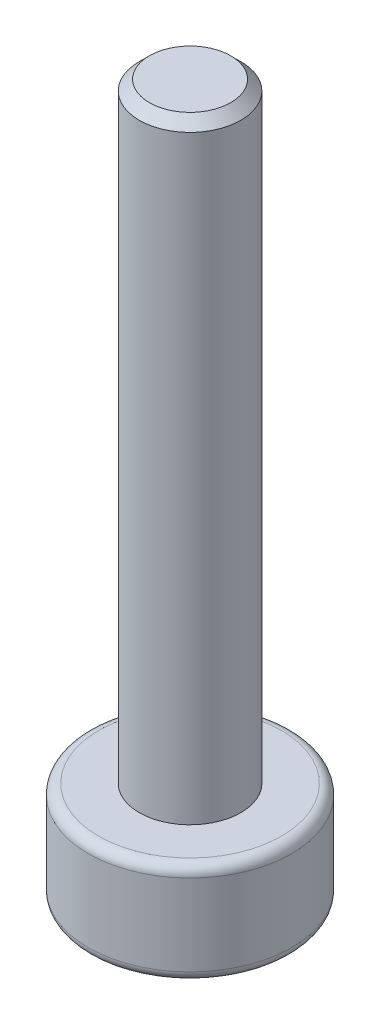
ISO-10303-21;
HEADER;
FILE_DESCRIPTION(('STEP AP214'),'2;1');
FILE_NAME('part.step','',(''),(''),'','','');
FILE_SCHEMA(('AUTOMOTIVE_DESIGN { 1 0 10303 214 1 1 1 1 }'));
ENDSEC;
DATA;
#1=APPLICATION_CONTEXT('core data for automotive mechanical design processes');
#2=APPLICATION_PROTOCOL_DEFINITION('international standard','automotive_design',2000,#1);
#3=PRODUCT_CONTEXT('',#1,'mechanical');
#4=PRODUCT('Part','Part','',(#3));
#5=PRODUCT_RELATED_PRODUCT_CATEGORY('part','',(#4));
#6=PRODUCT_DEFINITION_FORMATION('','',#4);
#7=PRODUCT_DEFINITION_CONTEXT('part definition',#1,'design');
#8=PRODUCT_DEFINITION('design','',#6,#7);
#9=PRODUCT_DEFINITION_SHAPE('','',#8);
#10=(LENGTH_UNIT() NAMED_UNIT(*) SI_UNIT(.MILLI.,.METRE.));
#11=(NAMED_UNIT(*) PLANE_ANGLE_UNIT() SI_UNIT($,.RADIAN.));
#12=(NAMED_UNIT(*) SI_UNIT($,.STERADIAN.) SOLID_ANGLE_UNIT());
#13=UNCERTAINTY_MEASURE_WITH_UNIT(LENGTH_MEASURE(1.E-05),#10,'distance_accuracy_value','');
#14=(GEOMETRIC_REPRESENTATION_CONTEXT(3) GLOBAL_UNCERTAINTY_ASSIGNED_CONTEXT((#13)) GLOBAL_UNIT_ASSIGNED_CONTEXT((#10,
#11,#12)) REPRESENTATION_CONTEXT('',''));
#15=CARTESIAN_POINT('',(0.,0.,0.));
#16=DIRECTION('',(0.,0.,1.));
#17=DIRECTION('',(1.,0.,0.));
#18=AXIS2_PLACEMENT_3D('',#15,#16,#17);
#19=CARTESIAN_POINT('',(0.,2.,0.));
#20=DIRECTION('',(0.,-1.,0.));
#21=DIRECTION('',(0.,0.,-1.));
#22=AXIS2_PLACEMENT_3D('',#19,#20,#21);
#23=CYLINDRICAL_SURFACE('',#22,2.);
#24=CARTESIAN_POINT('',(0.,0.2,0.));
#25=DIRECTION('',(0.,1.,0.));
#26=DIRECTION('',(0.,0.,1.));
#27=AXIS2_PLACEMENT_3D('',#24,#25,#26);
#28=CIRCLE('',#27,2.);
#29=CARTESIAN_POINT('',(0.,0.2,2.));
#30=VERTEX_POINT('',#29);
#31=EDGE_CURVE('E72',#30,#30,#28,.T.);
#32=ORIENTED_EDGE('',*,*,#31,.T.);
#33=EDGE_LOOP('',(#32));
#34=FACE_BOUND('',#33,.T.);
#35=CARTESIAN_POINT('',(0.,1.8,0.));
#36=DIRECTION('',(0.,1.,0.));
#37=DIRECTION('',(0.,0.,1.));
#38=AXIS2_PLACEMENT_3D('',#35,#36,#37);
#39=CIRCLE('',#38,2.);
#40=CARTESIAN_POINT('',(0.,1.8,2.));
#41=VERTEX_POINT('',#40);
#42=EDGE_CURVE('E76',#41,#41,#39,.F.);
#43=ORIENTED_EDGE('',*,*,#42,.T.);
#44=EDGE_LOOP('',(#43));
#45=FACE_BOUND('',#44,.T.);
#46=ADVANCED_FACE('F39',(#34,#45),#23,.T.);
#47=CARTESIAN_POINT('',(0.,2.,0.));
#48=DIRECTION('',(0.,1.,0.));
#49=DIRECTION('',(0.,0.,1.));
#50=AXIS2_PLACEMENT_3D('',#47,#48,#49);
#51=PLANE('',#50);
#52=CARTESIAN_POINT('',(0.,2.,0.));
#53=DIRECTION('',(0.,1.,0.));
#54=DIRECTION('',(0.,0.,1.));
#55=AXIS2_PLACEMENT_3D('',#52,#53,#54);
#56=CIRCLE('',#55,1.8);
#57=CARTESIAN_POINT('',(0.,2.,1.8));
#58=VERTEX_POINT('',#57);
#59=EDGE_CURVE('E64',#58,#58,#56,.T.);
#60=ORIENTED_EDGE('',*,*,#59,.T.);
#61=EDGE_LOOP('',(#60));
#62=FACE_BOUND('',#61,.T.);
#63=CARTESIAN_POINT('',(0.,2.,0.));
#64=DIRECTION('',(0.,1.,0.));
#65=DIRECTION('',(0.,0.,1.));
#66=AXIS2_PLACEMENT_3D('',#63,#64,#65);
#67=CIRCLE('',#66,1.);
#68=CARTESIAN_POINT('',(0.,2.,1.));
#69=VERTEX_POINT('',#68);
#70=EDGE_CURVE('E80',#69,#69,#67,.T.);
#71=ORIENTED_EDGE('',*,*,#70,.F.);
#72=EDGE_LOOP('',(#71));
#73=FACE_BOUND('',#72,.T.);
#74=ADVANCED_FACE('F107',(#62,#73),#51,.T.);
#75=CARTESIAN_POINT('',(0.,0.,0.));
#76=DIRECTION('',(0.,1.,0.));
#77=DIRECTION('',(0.,0.,1.));
#78=AXIS2_PLACEMENT_3D('',#75,#76,#77);
#79=PLANE('',#78);
#80=CARTESIAN_POINT('',(0.,0.,0.));
#81=DIRECTION('',(0.,1.,0.));
#82=DIRECTION('',(0.,0.,1.));
#83=AXIS2_PLACEMENT_3D('',#80,#81,#82);
#84=CIRCLE('',#83,0.864999999999996);
#85=CARTESIAN_POINT('',(0.,0.,-0.864999999999996));
#86=VERTEX_POINT('',#85);
#87=EDGE_CURVE('E53',#86,#86,#84,.T.);
#88=ORIENTED_EDGE('',*,*,#87,.T.);
#89=EDGE_LOOP('',(#88));
#90=FACE_BOUND('',#89,.T.);
#91=CARTESIAN_POINT('',(0.,0.,0.));
#92=DIRECTION('',(0.,1.,0.));
#93=DIRECTION('',(0.,0.,1.));
#94=AXIS2_PLACEMENT_3D('',#91,#92,#93);
#95=CIRCLE('',#94,1.8);
#96=CARTESIAN_POINT('',(0.,0.,1.8));
#97=VERTEX_POINT('',#96);
#98=EDGE_CURVE('E68',#97,#97,#95,.F.);
#99=ORIENTED_EDGE('',*,*,#98,.T.);
#100=EDGE_LOOP('',(#99));
#101=FACE_BOUND('',#100,.T.);
#102=ADVANCED_FACE('F113',(#90,#101),#79,.F.);
#103=CARTESIAN_POINT('',(0.,14.,0.));
#104=DIRECTION('',(0.,-1.,0.));
#105=DIRECTION('',(0.,0.,-1.));
#106=AXIS2_PLACEMENT_3D('',#103,#104,#105);
#107=CYLINDRICAL_SURFACE('',#106,1.);
#108=CARTESIAN_POINT('',(0.,13.8,0.));
#109=DIRECTION('',(0.,1.,0.));
#110=DIRECTION('',(0.,0.,1.));
#111=AXIS2_PLACEMENT_3D('',#108,#109,#110);
#112=CIRCLE('',#111,1.);
#113=CARTESIAN_POINT('',(0.,13.8,1.));
#114=VERTEX_POINT('',#113);
#115=EDGE_CURVE('E10',#114,#114,#112,.F.);
#116=ORIENTED_EDGE('',*,*,#115,.T.);
#117=EDGE_LOOP('',(#116));
#118=FACE_BOUND('',#117,.T.);
#119=ORIENTED_EDGE('',*,*,#70,.T.);
#120=EDGE_LOOP('',(#119));
#121=FACE_BOUND('',#120,.T.);
#122=ADVANCED_FACE('F137',(#118,#121),#107,.T.);
#123=CARTESIAN_POINT('',(0.,14.,0.));
#124=DIRECTION('',(0.,1.,0.));
#125=DIRECTION('',(0.,0.,1.));
#126=AXIS2_PLACEMENT_3D('',#123,#124,#125);
#127=PLANE('',#126);
#128=CARTESIAN_POINT('',(0.,14.,0.));
#129=DIRECTION('',(0.,1.,0.));
#130=DIRECTION('',(0.,0.,1.));
#131=AXIS2_PLACEMENT_3D('',#128,#129,#130);
#132=CIRCLE('',#131,0.799999999999999);
#133=CARTESIAN_POINT('',(0.,14.,0.799999999999999));
#134=VERTEX_POINT('',#133);
#135=EDGE_CURVE('E48',#134,#134,#132,.T.);
#136=ORIENTED_EDGE('',*,*,#135,.T.);
#137=EDGE_LOOP('',(#136));
#138=FACE_BOUND('',#137,.T.);
#139=ADVANCED_FACE('F120',(#138),#127,.T.);
#140=CARTESIAN_POINT('',(0.,0.2,0.));
#141=DIRECTION('',(0.,1.,0.));
#142=DIRECTION('',(0.,0.,1.));
#143=AXIS2_PLACEMENT_3D('',#140,#141,#142);
#144=TOROIDAL_SURFACE('',#143,1.8,0.2);
#145=ORIENTED_EDGE('',*,*,#98,.F.);
#146=EDGE_LOOP('',(#145));
#147=FACE_BOUND('',#146,.T.);
#148=ORIENTED_EDGE('',*,*,#31,.F.);
#149=EDGE_LOOP('',(#148));
#150=FACE_BOUND('',#149,.T.);
#151=ADVANCED_FACE('F102',(#147,#150),#144,.T.);
#152=CARTESIAN_POINT('',(0.,1.8,0.));
#153=DIRECTION('',(0.,1.,0.));
#154=DIRECTION('',(0.,0.,1.));
#155=AXIS2_PLACEMENT_3D('',#152,#153,#154);
#156=TOROIDAL_SURFACE('',#155,1.8,0.2);
#157=ORIENTED_EDGE('',*,*,#42,.F.);
#158=EDGE_LOOP('',(#157));
#159=FACE_BOUND('',#158,.T.);
#160=ORIENTED_EDGE('',*,*,#59,.F.);
#161=EDGE_LOOP('',(#160));
#162=FACE_BOUND('',#161,.T.);
#163=ADVANCED_FACE('F93',(#159,#162),#156,.T.);
#164=CARTESIAN_POINT('',(0.,1.52,0.));
#165=DIRECTION('',(0.,-1.,0.));
#166=DIRECTION('',(0.,0.,-1.));
#167=AXIS2_PLACEMENT_3D('',#164,#165,#166);
#168=CYLINDRICAL_SURFACE('',#167,0.765);
#169=CARTESIAN_POINT('',(0.,0.0999999999999968,0.));
#170=DIRECTION('',(0.,1.,0.));
#171=DIRECTION('',(0.,0.,1.));
#172=AXIS2_PLACEMENT_3D('',#169,#170,#171);
#173=CIRCLE('',#172,0.765);
#174=CARTESIAN_POINT('',(0.,0.0999999999999968,-0.765));
#175=VERTEX_POINT('',#174);
#176=EDGE_CURVE('E58',#175,#175,#173,.F.);
#177=ORIENTED_EDGE('',*,*,#176,.T.);
#178=EDGE_LOOP('',(#177));
#179=FACE_BOUND('',#178,.T.);
#180=CARTESIAN_POINT('',(0.,1.52,0.));
#181=DIRECTION('',(0.,-1.,0.));
#182=DIRECTION('',(0.,0.,-1.));
#183=AXIS2_PLACEMENT_3D('',#180,#181,#182);
#184=CIRCLE('',#183,0.765);
#185=CARTESIAN_POINT('',(0.,1.52,-0.765));
#186=VERTEX_POINT('',#185);
#187=EDGE_CURVE('E84',#186,#186,#184,.T.);
#188=ORIENTED_EDGE('',*,*,#187,.F.);
#189=EDGE_LOOP('',(#188));
#190=FACE_BOUND('',#189,.T.);
#191=ADVANCED_FACE('F91',(#179,#190),#168,.F.);
#192=CARTESIAN_POINT('',(0.,1.52,0.));
#193=DIRECTION('',(0.,-1.,0.));
#194=DIRECTION('',(0.,0.,-1.));
#195=AXIS2_PLACEMENT_3D('',#192,#193,#194);
#196=PLANE('',#195);
#197=ORIENTED_EDGE('',*,*,#187,.T.);
#198=EDGE_LOOP('',(#197));
#199=FACE_BOUND('',#198,.T.);
#200=ADVANCED_FACE('F89',(#199),#196,.T.);
#201=CARTESIAN_POINT('',(0.,0.0999999999999968,0.));
#202=DIRECTION('',(0.,-1.,0.));
#203=DIRECTION('',(0.,0.,-1.));
#204=AXIS2_PLACEMENT_3D('',#201,#202,#203);
#205=CONICAL_SURFACE('',#204,0.765,0.785398163397443);
#206=CARTESIAN_POINT('',(0.,0.,-0.864999999999996));
#207=CARTESIAN_POINT('',(0.,0.00104166666666662,-0.863958333333329));
#208=CARTESIAN_POINT('',(0.,0.00208333333333325,-0.862916666666663));
#209=CARTESIAN_POINT('',(0.,0.00416666666666652,-0.860833333333329));
#210=CARTESIAN_POINT('',(0.,0.00520833333333315,-0.859791666666663));
#211=CARTESIAN_POINT('',(0.,0.00729166666666642,-0.85770833333333));
#212=CARTESIAN_POINT('',(0.,0.00833333333333305,-0.856666666666663));
#213=CARTESIAN_POINT('',(0.,0.0104166666666663,-0.85458333333333));
#214=CARTESIAN_POINT('',(0.,0.011458333333333,-0.853541666666663));
#215=CARTESIAN_POINT('',(0.,0.0135416666666662,-0.85145833333333));
#216=CARTESIAN_POINT('',(0.,0.0145833333333329,-0.850416666666663));
#217=CARTESIAN_POINT('',(0.,0.0166666666666661,-0.84833333333333));
#218=CARTESIAN_POINT('',(0.,0.0177083333333327,-0.847291666666663));
#219=CARTESIAN_POINT('',(0.,0.019791666666666,-0.84520833333333));
#220=CARTESIAN_POINT('',(0.,0.0208333333333327,-0.844166666666663));
#221=CARTESIAN_POINT('',(0.,0.0229166666666659,-0.84208333333333));
#222=CARTESIAN_POINT('',(0.,0.0239583333333326,-0.841041666666664));
#223=CARTESIAN_POINT('',(0.,0.0260416666666658,-0.83895833333333));
#224=CARTESIAN_POINT('',(0.,0.0270833333333324,-0.837916666666664));
#225=CARTESIAN_POINT('',(0.,0.0291666666666657,-0.83583333333333));
#226=CARTESIAN_POINT('',(0.,0.0302083333333324,-0.834791666666664));
#227=CARTESIAN_POINT('',(0.,0.0322916666666656,-0.832708333333331));
#228=CARTESIAN_POINT('',(0.,0.0333333333333323,-0.831666666666664));
#229=CARTESIAN_POINT('',(0.,0.0354166666666655,-0.829583333333331));
#230=CARTESIAN_POINT('',(0.,0.0364583333333322,-0.828541666666664));
#231=CARTESIAN_POINT('',(0.,0.0385416666666654,-0.826458333333331));
#232=CARTESIAN_POINT('',(0.,0.0395833333333321,-0.825416666666664));
#233=CARTESIAN_POINT('',(0.,0.0416666666666653,-0.823333333333331));
#234=CARTESIAN_POINT('',(0.,0.042708333333332,-0.822291666666664));
#235=CARTESIAN_POINT('',(0.,0.0447916666666652,-0.820208333333331));
#236=CARTESIAN_POINT('',(0.,0.0458333333333319,-0.819166666666665));
#237=CARTESIAN_POINT('',(0.,0.0479166666666651,-0.817083333333331));
#238=CARTESIAN_POINT('',(0.,0.0489583333333318,-0.816041666666665));
#239=CARTESIAN_POINT('',(0.,0.051041666666665,-0.813958333333331));
#240=CARTESIAN_POINT('',(0.,0.0520833333333317,-0.812916666666665));
#241=CARTESIAN_POINT('',(0.,0.0541666666666649,-0.810833333333332));
#242=CARTESIAN_POINT('',(0.,0.0552083333333316,-0.809791666666665));
#243=CARTESIAN_POINT('',(0.,0.0572916666666648,-0.807708333333332));
#244=CARTESIAN_POINT('',(0.,0.0583333333333315,-0.806666666666665));
#245=CARTESIAN_POINT('',(0.,0.0604166666666647,-0.804583333333332));
#246=CARTESIAN_POINT('',(0.,0.0614583333333314,-0.803541666666665));
#247=CARTESIAN_POINT('',(0.,0.0635416666666646,-0.801458333333332));
#248=CARTESIAN_POINT('',(0.,0.0645833333333313,-0.800416666666665));
#249=CARTESIAN_POINT('',(0.,0.0666666666666645,-0.798333333333332));
#250=CARTESIAN_POINT('',(0.,0.0677083333333312,-0.797291666666665));
#251=CARTESIAN_POINT('',(0.,0.0697916666666644,-0.795208333333332));
#252=CARTESIAN_POINT('',(0.,0.070833333333331,-0.794166666666666));
#253=CARTESIAN_POINT('',(0.,0.0729166666666643,-0.792083333333332));
#254=CARTESIAN_POINT('',(0.,0.073958333333331,-0.791041666666666));
#255=CARTESIAN_POINT('',(0.,0.0760416666666642,-0.788958333333332));
#256=CARTESIAN_POINT('',(0.,0.0770833333333309,-0.787916666666666));
#257=CARTESIAN_POINT('',(0.,0.0791666666666641,-0.785833333333332));
#258=CARTESIAN_POINT('',(0.,0.0802083333333308,-0.784791666666666));
#259=CARTESIAN_POINT('',(0.,0.082291666666664,-0.782708333333333));
#260=CARTESIAN_POINT('',(0.,0.0833333333333307,-0.781666666666666));
#261=CARTESIAN_POINT('',(0.,0.0854166666666639,-0.779583333333333));
#262=CARTESIAN_POINT('',(0.,0.0864583333333306,-0.778541666666666));
#263=CARTESIAN_POINT('',(0.,0.0885416666666638,-0.776458333333333));
#264=CARTESIAN_POINT('',(0.,0.0895833333333305,-0.775416666666666));
#265=CARTESIAN_POINT('',(0.,0.0916666666666637,-0.773333333333333));
#266=CARTESIAN_POINT('',(0.,0.0927083333333304,-0.772291666666666));
#267=CARTESIAN_POINT('',(0.,0.0947916666666636,-0.770208333333333));
#268=CARTESIAN_POINT('',(0.,0.0958333333333303,-0.769166666666667));
#269=CARTESIAN_POINT('',(0.,0.0979166666666635,-0.767083333333333));
#270=CARTESIAN_POINT('',(0.,0.0989583333333302,-0.766041666666667));
#271=CARTESIAN_POINT('',(0.,0.0999999999999968,-0.765));
#272=B_SPLINE_CURVE_WITH_KNOTS('',3,(#206,#207,#208,#209,#210,#211,#212,#213,#214,#215,#216,
#217,#218,#219,#220,#221,#222,#223,#224,#225,#226,#227,#228,#229,#230,#231,#232,#233,#234,#235,
#236,#237,#238,#239,#240,#241,#242,#243,#244,#245,#246,#247,#248,#249,#250,#251,#252,#253,#254,
#255,#256,#257,#258,#259,#260,#261,#262,#263,#264,#265,#266,#267,#268,#269,#270,#271),
.UNSPECIFIED.,.F.,.F.,(4,2,2,2,2,2,2,2,2,2,2,2,2,2,2,2,2,2,2,2,2,2,2,2,2,2,2,2,2,2,2,2,4),(0.,
0.00441941738241576,0.00883883476483152,0.0132582521472473,0.017677669529663,0.0220970869120788,
0.0265165042944946,0.0309359216769102,0.035355339059326,0.0397747564417418,0.0441941738241575,
0.0486135912065733,0.0530330085889891,0.0574524259714048,0.0618718433538206,0.0662912607362363,
0.0707106781186521,0.0751300955010679,0.0795495128834836,0.0839689302658994,0.0883883476483152,
0.0928077650307309,0.0972271824131467,0.101646599795562,0.106066017177978,0.110485434560394,
0.11490485194281,0.119324269325226,0.123743686707641,0.128163104090057,0.132582521472473,
0.137001938854889,0.141421356237304),.UNSPECIFIED.);
#273=EDGE_CURVE('BSEAM100',#86,#175,#272,.T.);
#274=ORIENTED_EDGE('',*,*,#87,.F.);
#275=ORIENTED_EDGE('',*,*,#176,.F.);
#276=ORIENTED_EDGE('',*,*,#273,.T.);
#277=ORIENTED_EDGE('',*,*,#273,.F.);
#278=EDGE_LOOP('',(#274,#276,#275,#277));
#279=FACE_BOUND('',#278,.T.);
#280=ADVANCED_FACE('F100',(#279),#205,.F.);
#281=CARTESIAN_POINT('',(0.,14.,0.));
#282=DIRECTION('',(0.,-1.,0.));
#283=DIRECTION('',(0.,0.,-1.));
#284=AXIS2_PLACEMENT_3D('',#281,#282,#283);
#285=CONICAL_SURFACE('',#284,0.799999999999999,0.785398163397446);
#286=ORIENTED_EDGE('',*,*,#115,.F.);
#287=EDGE_LOOP('',(#286));
#288=FACE_BOUND('',#287,.T.);
#289=ORIENTED_EDGE('',*,*,#135,.F.);
#290=EDGE_LOOP('',(#289));
#291=FACE_BOUND('',#290,.T.);
#292=ADVANCED_FACE('F42',(#288,#291),#285,.T.);
#293=CLOSED_SHELL('',(#46,#74,#102,#122,#139,#151,#163,#191,#200,#280,#292));
#294=MANIFOLD_SOLID_BREP('B2',#293);
#295=ADVANCED_BREP_SHAPE_REPRESENTATION('',(#18,#294),#14);
#296=SHAPE_DEFINITION_REPRESENTATION(#9,#295);
ENDSEC;
END-ISO-10303-21;
